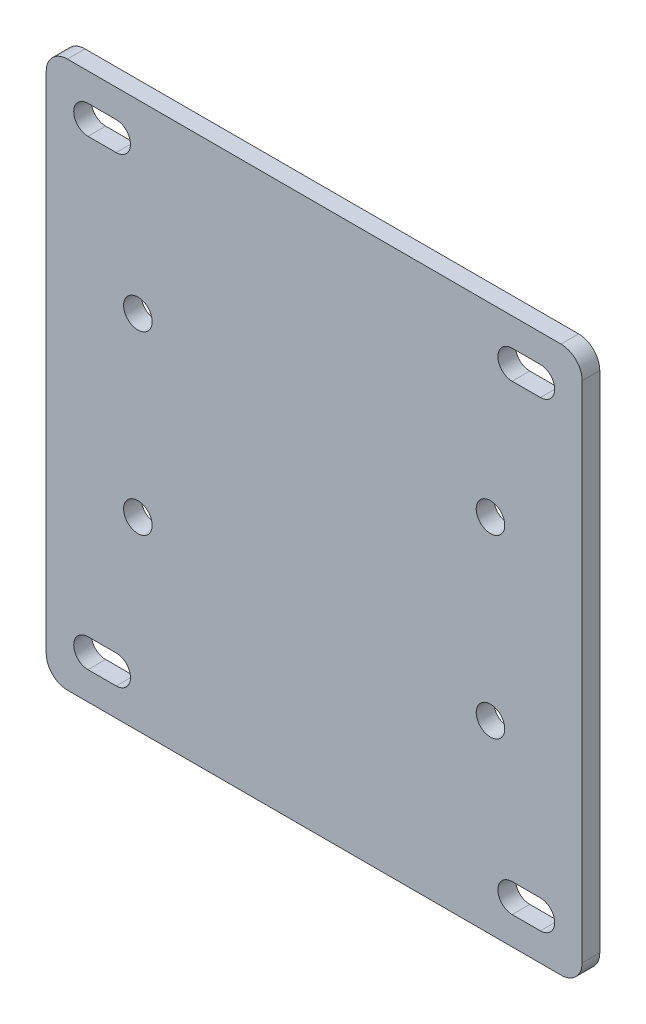
ISO-10303-21;
HEADER;
FILE_DESCRIPTION(('STEP AP214'),'2;1');
FILE_NAME('part.step','',(''),(''),'','','');
FILE_SCHEMA(('AUTOMOTIVE_DESIGN { 1 0 10303 214 1 1 1 1 }'));
ENDSEC;
DATA;
#1=APPLICATION_CONTEXT('core data for automotive mechanical design processes');
#2=APPLICATION_PROTOCOL_DEFINITION('international standard','automotive_design',2000,#1);
#3=PRODUCT_CONTEXT('',#1,'mechanical');
#4=PRODUCT('Part','Part','',(#3));
#5=PRODUCT_RELATED_PRODUCT_CATEGORY('part','',(#4));
#6=PRODUCT_DEFINITION_FORMATION('','',#4);
#7=PRODUCT_DEFINITION_CONTEXT('part definition',#1,'design');
#8=PRODUCT_DEFINITION('design','',#6,#7);
#9=PRODUCT_DEFINITION_SHAPE('','',#8);
#10=(LENGTH_UNIT() NAMED_UNIT(*) SI_UNIT(.MILLI.,.METRE.));
#11=(NAMED_UNIT(*) PLANE_ANGLE_UNIT() SI_UNIT($,.RADIAN.));
#12=(NAMED_UNIT(*) SI_UNIT($,.STERADIAN.) SOLID_ANGLE_UNIT());
#13=UNCERTAINTY_MEASURE_WITH_UNIT(LENGTH_MEASURE(1.E-05),#10,'distance_accuracy_value','');
#14=(GEOMETRIC_REPRESENTATION_CONTEXT(3) GLOBAL_UNCERTAINTY_ASSIGNED_CONTEXT((#13)) GLOBAL_UNIT_ASSIGNED_CONTEXT((#10,
#11,#12)) REPRESENTATION_CONTEXT('',''));
#15=CARTESIAN_POINT('',(0.,0.,0.));
#16=DIRECTION('',(0.,0.,1.));
#17=DIRECTION('',(1.,0.,0.));
#18=AXIS2_PLACEMENT_3D('',#15,#16,#17);
#19=CARTESIAN_POINT('',(0.,0.,5.));
#20=DIRECTION('',(0.,0.,1.));
#21=DIRECTION('',(1.,0.,0.));
#22=AXIS2_PLACEMENT_3D('',#19,#20,#21);
#23=PLANE('',#22);
#24=CARTESIAN_POINT('',(50.,-25.,5.));
#25=DIRECTION('',(0.,0.,-1.));
#26=DIRECTION('',(1.,0.,0.));
#27=AXIS2_PLACEMENT_3D('',#24,#25,#26);
#28=CIRCLE('',#27,4.05);
#29=CARTESIAN_POINT('',(45.95,-25.,5.));
#30=VERTEX_POINT('',#29);
#31=EDGE_CURVE('E417',#30,#30,#28,.T.);
#32=ORIENTED_EDGE('',*,*,#31,.T.);
#33=EDGE_LOOP('',(#32));
#34=FACE_BOUND('',#33,.T.);
#35=CARTESIAN_POINT('',(-50.,25.,5.));
#36=DIRECTION('',(0.,0.,-1.));
#37=DIRECTION('',(1.,0.,0.));
#38=AXIS2_PLACEMENT_3D('',#35,#36,#37);
#39=CIRCLE('',#38,4.05);
#40=CARTESIAN_POINT('',(-54.05,25.,5.));
#41=VERTEX_POINT('',#40);
#42=EDGE_CURVE('E295',#41,#41,#39,.T.);
#43=ORIENTED_EDGE('',*,*,#42,.T.);
#44=EDGE_LOOP('',(#43));
#45=FACE_BOUND('',#44,.T.);
#46=CARTESIAN_POINT('',(-50.,-25.,5.));
#47=DIRECTION('',(0.,0.,-1.));
#48=DIRECTION('',(1.,0.,0.));
#49=AXIS2_PLACEMENT_3D('',#46,#47,#48);
#50=CIRCLE('',#49,4.05);
#51=CARTESIAN_POINT('',(-54.05,-25.,5.));
#52=VERTEX_POINT('',#51);
#53=EDGE_CURVE('E346',#52,#52,#50,.T.);
#54=ORIENTED_EDGE('',*,*,#53,.T.);
#55=EDGE_LOOP('',(#54));
#56=FACE_BOUND('',#55,.T.);
#57=CARTESIAN_POINT('',(50.,25.,5.));
#58=DIRECTION('',(0.,0.,-1.));
#59=DIRECTION('',(1.,0.,0.));
#60=AXIS2_PLACEMENT_3D('',#57,#58,#59);
#61=CIRCLE('',#60,4.05);
#62=CARTESIAN_POINT('',(45.95,25.,5.));
#63=VERTEX_POINT('',#62);
#64=EDGE_CURVE('E344',#63,#63,#61,.T.);
#65=ORIENTED_EDGE('',*,*,#64,.T.);
#66=EDGE_LOOP('',(#65));
#67=FACE_BOUND('',#66,.T.);
#68=DIRECTION('',(1.,0.,0.));
#69=VECTOR('',#68,1.);
#70=CARTESIAN_POINT('',(-32.075,69.55,5.));
#71=LINE('',#70,#69);
#72=CARTESIAN_POINT('',(-64.15,69.55,5.));
#73=VERTEX_POINT('',#72);
#74=CARTESIAN_POINT('',(-56.15,69.55,5.));
#75=VERTEX_POINT('',#74);
#76=EDGE_CURVE('E290',#73,#75,#71,.T.);
#77=ORIENTED_EDGE('',*,*,#76,.T.);
#78=CARTESIAN_POINT('',(-56.15,65.5,5.));
#79=DIRECTION('',(0.,0.,-1.));
#80=DIRECTION('',(0.,1.,0.));
#81=AXIS2_PLACEMENT_3D('',#78,#79,#80);
#82=CIRCLE('',#81,4.05);
#83=CARTESIAN_POINT('',(-56.15,61.45,5.));
#84=VERTEX_POINT('',#83);
#85=EDGE_CURVE('E340',#75,#84,#82,.T.);
#86=ORIENTED_EDGE('',*,*,#85,.T.);
#87=DIRECTION('',(-1.,0.,0.));
#88=VECTOR('',#87,1.);
#89=CARTESIAN_POINT('',(-28.075,61.45,5.));
#90=LINE('',#89,#88);
#91=CARTESIAN_POINT('',(-64.15,61.45,5.));
#92=VERTEX_POINT('',#91);
#93=EDGE_CURVE('E422',#84,#92,#90,.T.);
#94=ORIENTED_EDGE('',*,*,#93,.T.);
#95=CARTESIAN_POINT('',(-64.15,65.5,5.));
#96=DIRECTION('',(0.,0.,-1.));
#97=DIRECTION('',(0.,-1.,0.));
#98=AXIS2_PLACEMENT_3D('',#95,#96,#97);
#99=CIRCLE('',#98,4.05);
#100=EDGE_CURVE('E391',#92,#73,#99,.T.);
#101=ORIENTED_EDGE('',*,*,#100,.T.);
#102=EDGE_LOOP('',(#77,#86,#94,#101));
#103=FACE_BOUND('',#102,.T.);
#104=DIRECTION('',(1.,0.,0.));
#105=VECTOR('',#104,1.);
#106=CARTESIAN_POINT('',(28.075,69.55,5.));
#107=LINE('',#106,#105);
#108=CARTESIAN_POINT('',(56.15,69.55,5.));
#109=VERTEX_POINT('',#108);
#110=CARTESIAN_POINT('',(64.15,69.55,5.));
#111=VERTEX_POINT('',#110);
#112=EDGE_CURVE('E339',#109,#111,#107,.T.);
#113=ORIENTED_EDGE('',*,*,#112,.T.);
#114=CARTESIAN_POINT('',(64.15,65.5,5.));
#115=DIRECTION('',(0.,0.,-1.));
#116=DIRECTION('',(0.,1.,0.));
#117=AXIS2_PLACEMENT_3D('',#114,#115,#116);
#118=CIRCLE('',#117,4.05);
#119=CARTESIAN_POINT('',(64.15,61.45,5.));
#120=VERTEX_POINT('',#119);
#121=EDGE_CURVE('E323',#111,#120,#118,.T.);
#122=ORIENTED_EDGE('',*,*,#121,.T.);
#123=DIRECTION('',(-1.,0.,0.));
#124=VECTOR('',#123,1.);
#125=CARTESIAN_POINT('',(32.075,61.45,5.));
#126=LINE('',#125,#124);
#127=CARTESIAN_POINT('',(56.15,61.45,5.));
#128=VERTEX_POINT('',#127);
#129=EDGE_CURVE('E470',#120,#128,#126,.T.);
#130=ORIENTED_EDGE('',*,*,#129,.T.);
#131=CARTESIAN_POINT('',(56.15,65.5,5.));
#132=DIRECTION('',(0.,0.,-1.));
#133=DIRECTION('',(0.,-1.,0.));
#134=AXIS2_PLACEMENT_3D('',#131,#132,#133);
#135=CIRCLE('',#134,4.05);
#136=EDGE_CURVE('E407',#128,#109,#135,.T.);
#137=ORIENTED_EDGE('',*,*,#136,.T.);
#138=EDGE_LOOP('',(#113,#122,#130,#137));
#139=FACE_BOUND('',#138,.T.);
#140=DIRECTION('',(1.,0.,0.));
#141=VECTOR('',#140,1.);
#142=CARTESIAN_POINT('',(-32.075,-61.45,5.));
#143=LINE('',#142,#141);
#144=CARTESIAN_POINT('',(-64.15,-61.45,5.));
#145=VERTEX_POINT('',#144);
#146=CARTESIAN_POINT('',(-56.15,-61.45,5.));
#147=VERTEX_POINT('',#146);
#148=EDGE_CURVE('E299',#145,#147,#143,.T.);
#149=ORIENTED_EDGE('',*,*,#148,.T.);
#150=CARTESIAN_POINT('',(-56.15,-65.5,5.));
#151=DIRECTION('',(0.,0.,-1.));
#152=DIRECTION('',(0.,1.,0.));
#153=AXIS2_PLACEMENT_3D('',#150,#151,#152);
#154=CIRCLE('',#153,4.05);
#155=CARTESIAN_POINT('',(-56.15,-69.55,5.));
#156=VERTEX_POINT('',#155);
#157=EDGE_CURVE('E500',#147,#156,#154,.T.);
#158=ORIENTED_EDGE('',*,*,#157,.T.);
#159=DIRECTION('',(-1.,0.,0.));
#160=VECTOR('',#159,1.);
#161=CARTESIAN_POINT('',(-28.075,-69.55,5.));
#162=LINE('',#161,#160);
#163=CARTESIAN_POINT('',(-64.15,-69.55,5.));
#164=VERTEX_POINT('',#163);
#165=EDGE_CURVE('E437',#156,#164,#162,.T.);
#166=ORIENTED_EDGE('',*,*,#165,.T.);
#167=CARTESIAN_POINT('',(-64.15,-65.5,5.));
#168=DIRECTION('',(0.,0.,-1.));
#169=DIRECTION('',(0.,-1.,0.));
#170=AXIS2_PLACEMENT_3D('',#167,#168,#169);
#171=CIRCLE('',#170,4.05);
#172=EDGE_CURVE('E465',#164,#145,#171,.T.);
#173=ORIENTED_EDGE('',*,*,#172,.T.);
#174=EDGE_LOOP('',(#149,#158,#166,#173));
#175=FACE_BOUND('',#174,.T.);
#176=DIRECTION('',(1.,0.,0.));
#177=VECTOR('',#176,1.);
#178=CARTESIAN_POINT('',(28.075,-61.45,5.));
#179=LINE('',#178,#177);
#180=CARTESIAN_POINT('',(56.15,-61.45,5.));
#181=VERTEX_POINT('',#180);
#182=CARTESIAN_POINT('',(64.15,-61.45,5.));
#183=VERTEX_POINT('',#182);
#184=EDGE_CURVE('E328',#181,#183,#179,.T.);
#185=ORIENTED_EDGE('',*,*,#184,.T.);
#186=CARTESIAN_POINT('',(64.15,-65.5,5.));
#187=DIRECTION('',(0.,0.,-1.));
#188=DIRECTION('',(0.,1.,0.));
#189=AXIS2_PLACEMENT_3D('',#186,#187,#188);
#190=CIRCLE('',#189,4.05);
#191=CARTESIAN_POINT('',(64.15,-69.55,5.));
#192=VERTEX_POINT('',#191);
#193=EDGE_CURVE('E312',#183,#192,#190,.T.);
#194=ORIENTED_EDGE('',*,*,#193,.T.);
#195=DIRECTION('',(-1.,0.,0.));
#196=VECTOR('',#195,1.);
#197=CARTESIAN_POINT('',(32.075,-69.55,5.));
#198=LINE('',#197,#196);
#199=CARTESIAN_POINT('',(56.15,-69.55,5.));
#200=VERTEX_POINT('',#199);
#201=EDGE_CURVE('E376',#192,#200,#198,.T.);
#202=ORIENTED_EDGE('',*,*,#201,.T.);
#203=CARTESIAN_POINT('',(56.15,-65.5,5.));
#204=DIRECTION('',(0.,0.,-1.));
#205=DIRECTION('',(0.,-1.,0.));
#206=AXIS2_PLACEMENT_3D('',#203,#204,#205);
#207=CIRCLE('',#206,4.05);
#208=EDGE_CURVE('E371',#200,#181,#207,.T.);
#209=ORIENTED_EDGE('',*,*,#208,.T.);
#210=EDGE_LOOP('',(#185,#194,#202,#209));
#211=FACE_BOUND('',#210,.T.);
#212=DIRECTION('',(-1.,0.,0.));
#213=VECTOR('',#212,1.);
#214=CARTESIAN_POINT('',(-70.,77.5,5.));
#215=LINE('',#214,#213);
#216=CARTESIAN_POINT('',(70.,77.5,5.));
#217=VERTEX_POINT('',#216);
#218=CARTESIAN_POINT('',(-70.,77.5,5.));
#219=VERTEX_POINT('',#218);
#220=EDGE_CURVE('E11',#217,#219,#215,.T.);
#221=ORIENTED_EDGE('',*,*,#220,.T.);
#222=CARTESIAN_POINT('',(-70.,71.5,5.));
#223=DIRECTION('',(0.,0.,1.));
#224=DIRECTION('',(0.,-1.,0.));
#225=AXIS2_PLACEMENT_3D('',#222,#223,#224);
#226=CIRCLE('',#225,6.);
#227=CARTESIAN_POINT('',(-76.,71.5,5.));
#228=VERTEX_POINT('',#227);
#229=EDGE_CURVE('E366',#219,#228,#226,.T.);
#230=ORIENTED_EDGE('',*,*,#229,.T.);
#231=DIRECTION('',(0.,-1.,0.));
#232=VECTOR('',#231,1.);
#233=CARTESIAN_POINT('',(-76.,-71.5,5.));
#234=LINE('',#233,#232);
#235=CARTESIAN_POINT('',(-76.,-71.5,5.));
#236=VERTEX_POINT('',#235);
#237=EDGE_CURVE('E255',#228,#236,#234,.T.);
#238=ORIENTED_EDGE('',*,*,#237,.T.);
#239=CARTESIAN_POINT('',(-70.,-71.5,5.));
#240=DIRECTION('',(0.,0.,1.));
#241=DIRECTION('',(1.,0.,0.));
#242=AXIS2_PLACEMENT_3D('',#239,#240,#241);
#243=CIRCLE('',#242,6.);
#244=CARTESIAN_POINT('',(-70.,-77.5,5.));
#245=VERTEX_POINT('',#244);
#246=EDGE_CURVE('E262',#236,#245,#243,.T.);
#247=ORIENTED_EDGE('',*,*,#246,.T.);
#248=DIRECTION('',(1.,0.,0.));
#249=VECTOR('',#248,1.);
#250=CARTESIAN_POINT('',(70.,-77.5,5.));
#251=LINE('',#250,#249);
#252=CARTESIAN_POINT('',(70.,-77.5,5.));
#253=VERTEX_POINT('',#252);
#254=EDGE_CURVE('E279',#245,#253,#251,.T.);
#255=ORIENTED_EDGE('',*,*,#254,.T.);
#256=CARTESIAN_POINT('',(70.,-71.5,5.));
#257=DIRECTION('',(0.,0.,1.));
#258=DIRECTION('',(0.,1.,0.));
#259=AXIS2_PLACEMENT_3D('',#256,#257,#258);
#260=CIRCLE('',#259,6.);
#261=CARTESIAN_POINT('',(76.,-71.5,5.));
#262=VERTEX_POINT('',#261);
#263=EDGE_CURVE('E361',#253,#262,#260,.T.);
#264=ORIENTED_EDGE('',*,*,#263,.T.);
#265=DIRECTION('',(0.,1.,0.));
#266=VECTOR('',#265,1.);
#267=CARTESIAN_POINT('',(76.,71.5,5.));
#268=LINE('',#267,#266);
#269=CARTESIAN_POINT('',(76.,71.5,5.));
#270=VERTEX_POINT('',#269);
#271=EDGE_CURVE('E384',#262,#270,#268,.T.);
#272=ORIENTED_EDGE('',*,*,#271,.T.);
#273=CARTESIAN_POINT('',(70.,71.5,5.));
#274=DIRECTION('',(0.,0.,1.));
#275=DIRECTION('',(-1.,0.,0.));
#276=AXIS2_PLACEMENT_3D('',#273,#274,#275);
#277=CIRCLE('',#276,6.);
#278=EDGE_CURVE('E357',#270,#217,#277,.T.);
#279=ORIENTED_EDGE('',*,*,#278,.T.);
#280=EDGE_LOOP('',(#221,#230,#238,#247,#255,#264,#272,#279));
#281=FACE_BOUND('',#280,.T.);
#282=ADVANCED_FACE('F17',(#34,#45,#56,#67,#103,#139,#175,#211,#281),#23,.T.);
#283=CARTESIAN_POINT('',(0.,0.,0.));
#284=DIRECTION('',(0.,0.,1.));
#285=DIRECTION('',(1.,0.,0.));
#286=AXIS2_PLACEMENT_3D('',#283,#284,#285);
#287=PLANE('',#286);
#288=CARTESIAN_POINT('',(50.,-25.,0.));
#289=DIRECTION('',(0.,0.,1.));
#290=DIRECTION('',(1.,0.,0.));
#291=AXIS2_PLACEMENT_3D('',#288,#289,#290);
#292=CIRCLE('',#291,4.05);
#293=CARTESIAN_POINT('',(45.95,-25.,0.));
#294=VERTEX_POINT('',#293);
#295=EDGE_CURVE('E432',#294,#294,#292,.T.);
#296=ORIENTED_EDGE('',*,*,#295,.T.);
#297=EDGE_LOOP('',(#296));
#298=FACE_BOUND('',#297,.T.);
#299=CARTESIAN_POINT('',(-50.,25.,0.));
#300=DIRECTION('',(0.,0.,1.));
#301=DIRECTION('',(1.,0.,0.));
#302=AXIS2_PLACEMENT_3D('',#299,#300,#301);
#303=CIRCLE('',#302,4.05);
#304=CARTESIAN_POINT('',(-54.05,25.,0.));
#305=VERTEX_POINT('',#304);
#306=EDGE_CURVE('E294',#305,#305,#303,.T.);
#307=ORIENTED_EDGE('',*,*,#306,.T.);
#308=EDGE_LOOP('',(#307));
#309=FACE_BOUND('',#308,.T.);
#310=CARTESIAN_POINT('',(-50.,-25.,0.));
#311=DIRECTION('',(0.,0.,1.));
#312=DIRECTION('',(1.,0.,0.));
#313=AXIS2_PLACEMENT_3D('',#310,#311,#312);
#314=CIRCLE('',#313,4.05);
#315=CARTESIAN_POINT('',(-54.05,-25.,0.));
#316=VERTEX_POINT('',#315);
#317=EDGE_CURVE('E416',#316,#316,#314,.T.);
#318=ORIENTED_EDGE('',*,*,#317,.T.);
#319=EDGE_LOOP('',(#318));
#320=FACE_BOUND('',#319,.T.);
#321=CARTESIAN_POINT('',(50.,25.,0.));
#322=DIRECTION('',(0.,0.,1.));
#323=DIRECTION('',(1.,0.,0.));
#324=AXIS2_PLACEMENT_3D('',#321,#322,#323);
#325=CIRCLE('',#324,4.05);
#326=CARTESIAN_POINT('',(45.95,25.,0.));
#327=VERTEX_POINT('',#326);
#328=EDGE_CURVE('E351',#327,#327,#325,.T.);
#329=ORIENTED_EDGE('',*,*,#328,.T.);
#330=EDGE_LOOP('',(#329));
#331=FACE_BOUND('',#330,.T.);
#332=DIRECTION('',(-1.,0.,0.));
#333=VECTOR('',#332,1.);
#334=CARTESIAN_POINT('',(-32.075,69.55,0.));
#335=LINE('',#334,#333);
#336=CARTESIAN_POINT('',(-56.15,69.55,0.));
#337=VERTEX_POINT('',#336);
#338=CARTESIAN_POINT('',(-64.15,69.55,0.));
#339=VERTEX_POINT('',#338);
#340=EDGE_CURVE('E326',#337,#339,#335,.T.);
#341=ORIENTED_EDGE('',*,*,#340,.T.);
#342=CARTESIAN_POINT('',(-64.15,65.5,0.));
#343=DIRECTION('',(0.,0.,1.));
#344=DIRECTION('',(0.,-1.,0.));
#345=AXIS2_PLACEMENT_3D('',#342,#343,#344);
#346=CIRCLE('',#345,4.05);
#347=CARTESIAN_POINT('',(-64.15,61.45,0.));
#348=VERTEX_POINT('',#347);
#349=EDGE_CURVE('E289',#339,#348,#346,.T.);
#350=ORIENTED_EDGE('',*,*,#349,.T.);
#351=DIRECTION('',(1.,0.,0.));
#352=VECTOR('',#351,1.);
#353=CARTESIAN_POINT('',(-28.075,61.45,0.));
#354=LINE('',#353,#352);
#355=CARTESIAN_POINT('',(-56.15,61.45,0.));
#356=VERTEX_POINT('',#355);
#357=EDGE_CURVE('E426',#348,#356,#354,.T.);
#358=ORIENTED_EDGE('',*,*,#357,.T.);
#359=CARTESIAN_POINT('',(-56.15,65.5,0.));
#360=DIRECTION('',(0.,0.,1.));
#361=DIRECTION('',(0.,1.,0.));
#362=AXIS2_PLACEMENT_3D('',#359,#360,#361);
#363=CIRCLE('',#362,4.05);
#364=EDGE_CURVE('E345',#356,#337,#363,.T.);
#365=ORIENTED_EDGE('',*,*,#364,.T.);
#366=EDGE_LOOP('',(#341,#350,#358,#365));
#367=FACE_BOUND('',#366,.T.);
#368=DIRECTION('',(-1.,0.,0.));
#369=VECTOR('',#368,1.);
#370=CARTESIAN_POINT('',(28.075,69.55,0.));
#371=LINE('',#370,#369);
#372=CARTESIAN_POINT('',(64.15,69.55,0.));
#373=VERTEX_POINT('',#372);
#374=CARTESIAN_POINT('',(56.15,69.55,0.));
#375=VERTEX_POINT('',#374);
#376=EDGE_CURVE('E461',#373,#375,#371,.T.);
#377=ORIENTED_EDGE('',*,*,#376,.T.);
#378=CARTESIAN_POINT('',(56.15,65.5,0.));
#379=DIRECTION('',(0.,0.,1.));
#380=DIRECTION('',(0.,-1.,0.));
#381=AXIS2_PLACEMENT_3D('',#378,#379,#380);
#382=CIRCLE('',#381,4.05);
#383=CARTESIAN_POINT('',(56.15,61.45,0.));
#384=VERTEX_POINT('',#383);
#385=EDGE_CURVE('E338',#375,#384,#382,.T.);
#386=ORIENTED_EDGE('',*,*,#385,.T.);
#387=DIRECTION('',(1.,0.,0.));
#388=VECTOR('',#387,1.);
#389=CARTESIAN_POINT('',(32.075,61.45,0.));
#390=LINE('',#389,#388);
#391=CARTESIAN_POINT('',(64.15,61.45,0.));
#392=VERTEX_POINT('',#391);
#393=EDGE_CURVE('E555',#384,#392,#390,.T.);
#394=ORIENTED_EDGE('',*,*,#393,.T.);
#395=CARTESIAN_POINT('',(64.15,65.5,0.));
#396=DIRECTION('',(0.,0.,1.));
#397=DIRECTION('',(0.,1.,0.));
#398=AXIS2_PLACEMENT_3D('',#395,#396,#397);
#399=CIRCLE('',#398,4.05);
#400=EDGE_CURVE('E327',#392,#373,#399,.T.);
#401=ORIENTED_EDGE('',*,*,#400,.T.);
#402=EDGE_LOOP('',(#377,#386,#394,#401));
#403=FACE_BOUND('',#402,.T.);
#404=DIRECTION('',(-1.,0.,0.));
#405=VECTOR('',#404,1.);
#406=CARTESIAN_POINT('',(-32.075,-61.45,0.));
#407=LINE('',#406,#405);
#408=CARTESIAN_POINT('',(-56.15,-61.45,0.));
#409=VERTEX_POINT('',#408);
#410=CARTESIAN_POINT('',(-64.15,-61.45,0.));
#411=VERTEX_POINT('',#410);
#412=EDGE_CURVE('E300',#409,#411,#407,.T.);
#413=ORIENTED_EDGE('',*,*,#412,.T.);
#414=CARTESIAN_POINT('',(-64.15,-65.5,0.));
#415=DIRECTION('',(0.,0.,1.));
#416=DIRECTION('',(0.,-1.,0.));
#417=AXIS2_PLACEMENT_3D('',#414,#415,#416);
#418=CIRCLE('',#417,4.05);
#419=CARTESIAN_POINT('',(-64.15,-69.55,0.));
#420=VERTEX_POINT('',#419);
#421=EDGE_CURVE('E520',#411,#420,#418,.T.);
#422=ORIENTED_EDGE('',*,*,#421,.T.);
#423=DIRECTION('',(1.,0.,0.));
#424=VECTOR('',#423,1.);
#425=CARTESIAN_POINT('',(-28.075,-69.55,0.));
#426=LINE('',#425,#424);
#427=CARTESIAN_POINT('',(-56.15,-69.55,0.));
#428=VERTEX_POINT('',#427);
#429=EDGE_CURVE('E433',#420,#428,#426,.T.);
#430=ORIENTED_EDGE('',*,*,#429,.T.);
#431=CARTESIAN_POINT('',(-56.15,-65.5,0.));
#432=DIRECTION('',(0.,0.,1.));
#433=DIRECTION('',(0.,1.,0.));
#434=AXIS2_PLACEMENT_3D('',#431,#432,#433);
#435=CIRCLE('',#434,4.05);
#436=EDGE_CURVE('E492',#428,#409,#435,.T.);
#437=ORIENTED_EDGE('',*,*,#436,.T.);
#438=EDGE_LOOP('',(#413,#422,#430,#437));
#439=FACE_BOUND('',#438,.T.);
#440=DIRECTION('',(-1.,0.,0.));
#441=VECTOR('',#440,1.);
#442=CARTESIAN_POINT('',(28.075,-61.45,0.));
#443=LINE('',#442,#441);
#444=CARTESIAN_POINT('',(64.15,-61.45,0.));
#445=VERTEX_POINT('',#444);
#446=CARTESIAN_POINT('',(56.15,-61.45,0.));
#447=VERTEX_POINT('',#446);
#448=EDGE_CURVE('E477',#445,#447,#443,.T.);
#449=ORIENTED_EDGE('',*,*,#448,.T.);
#450=CARTESIAN_POINT('',(56.15,-65.5,0.));
#451=DIRECTION('',(0.,0.,1.));
#452=DIRECTION('',(0.,-1.,0.));
#453=AXIS2_PLACEMENT_3D('',#450,#451,#452);
#454=CIRCLE('',#453,4.05);
#455=CARTESIAN_POINT('',(56.15,-69.55,0.));
#456=VERTEX_POINT('',#455);
#457=EDGE_CURVE('E367',#447,#456,#454,.T.);
#458=ORIENTED_EDGE('',*,*,#457,.T.);
#459=DIRECTION('',(1.,0.,0.));
#460=VECTOR('',#459,1.);
#461=CARTESIAN_POINT('',(32.075,-69.55,0.));
#462=LINE('',#461,#460);
#463=CARTESIAN_POINT('',(64.15,-69.55,0.));
#464=VERTEX_POINT('',#463);
#465=EDGE_CURVE('E398',#456,#464,#462,.T.);
#466=ORIENTED_EDGE('',*,*,#465,.T.);
#467=CARTESIAN_POINT('',(64.15,-65.5,0.));
#468=DIRECTION('',(0.,0.,1.));
#469=DIRECTION('',(0.,1.,0.));
#470=AXIS2_PLACEMENT_3D('',#467,#468,#469);
#471=CIRCLE('',#470,4.05);
#472=EDGE_CURVE('E319',#464,#445,#471,.T.);
#473=ORIENTED_EDGE('',*,*,#472,.T.);
#474=EDGE_LOOP('',(#449,#458,#466,#473));
#475=FACE_BOUND('',#474,.T.);
#476=DIRECTION('',(1.,0.,0.));
#477=VECTOR('',#476,1.);
#478=CARTESIAN_POINT('',(-70.,77.5,0.));
#479=LINE('',#478,#477);
#480=CARTESIAN_POINT('',(-70.,77.5,0.));
#481=VERTEX_POINT('',#480);
#482=CARTESIAN_POINT('',(70.,77.5,0.));
#483=VERTEX_POINT('',#482);
#484=EDGE_CURVE('E28',#481,#483,#479,.T.);
#485=ORIENTED_EDGE('',*,*,#484,.T.);
#486=CARTESIAN_POINT('',(70.,71.5,0.));
#487=DIRECTION('',(0.,0.,-1.));
#488=DIRECTION('',(-1.,0.,0.));
#489=AXIS2_PLACEMENT_3D('',#486,#487,#488);
#490=CIRCLE('',#489,6.);
#491=CARTESIAN_POINT('',(76.,71.5,0.));
#492=VERTEX_POINT('',#491);
#493=EDGE_CURVE('E427',#483,#492,#490,.T.);
#494=ORIENTED_EDGE('',*,*,#493,.T.);
#495=DIRECTION('',(0.,-1.,0.));
#496=VECTOR('',#495,1.);
#497=CARTESIAN_POINT('',(76.,71.5,0.));
#498=LINE('',#497,#496);
#499=CARTESIAN_POINT('',(76.,-71.5,0.));
#500=VERTEX_POINT('',#499);
#501=EDGE_CURVE('E356',#492,#500,#498,.T.);
#502=ORIENTED_EDGE('',*,*,#501,.T.);
#503=CARTESIAN_POINT('',(70.,-71.5,0.));
#504=DIRECTION('',(0.,0.,-1.));
#505=DIRECTION('',(0.,1.,0.));
#506=AXIS2_PLACEMENT_3D('',#503,#504,#505);
#507=CIRCLE('',#506,6.);
#508=CARTESIAN_POINT('',(70.,-77.5,0.));
#509=VERTEX_POINT('',#508);
#510=EDGE_CURVE('E358',#500,#509,#507,.T.);
#511=ORIENTED_EDGE('',*,*,#510,.T.);
#512=DIRECTION('',(-1.,0.,0.));
#513=VECTOR('',#512,1.);
#514=CARTESIAN_POINT('',(70.,-77.5,0.));
#515=LINE('',#514,#513);
#516=CARTESIAN_POINT('',(-70.,-77.5,0.));
#517=VERTEX_POINT('',#516);
#518=EDGE_CURVE('E269',#509,#517,#515,.T.);
#519=ORIENTED_EDGE('',*,*,#518,.T.);
#520=CARTESIAN_POINT('',(-70.,-71.5,0.));
#521=DIRECTION('',(0.,0.,-1.));
#522=DIRECTION('',(1.,0.,0.));
#523=AXIS2_PLACEMENT_3D('',#520,#521,#522);
#524=CIRCLE('',#523,6.);
#525=CARTESIAN_POINT('',(-76.,-71.5,0.));
#526=VERTEX_POINT('',#525);
#527=EDGE_CURVE('E260',#517,#526,#524,.T.);
#528=ORIENTED_EDGE('',*,*,#527,.T.);
#529=DIRECTION('',(0.,1.,0.));
#530=VECTOR('',#529,1.);
#531=CARTESIAN_POINT('',(-76.,-71.5,0.));
#532=LINE('',#531,#530);
#533=CARTESIAN_POINT('',(-76.,71.5,0.));
#534=VERTEX_POINT('',#533);
#535=EDGE_CURVE('E243',#526,#534,#532,.T.);
#536=ORIENTED_EDGE('',*,*,#535,.T.);
#537=CARTESIAN_POINT('',(-70.,71.5,0.));
#538=DIRECTION('',(0.,0.,-1.));
#539=DIRECTION('',(0.,-1.,0.));
#540=AXIS2_PLACEMENT_3D('',#537,#538,#539);
#541=CIRCLE('',#540,6.);
#542=EDGE_CURVE('E363',#534,#481,#541,.T.);
#543=ORIENTED_EDGE('',*,*,#542,.T.);
#544=EDGE_LOOP('',(#485,#494,#502,#511,#519,#528,#536,#543));
#545=FACE_BOUND('',#544,.T.);
#546=ADVANCED_FACE('F267',(#298,#309,#320,#331,#367,#403,#439,#475,#545),#287,.F.);
#547=CARTESIAN_POINT('',(70.,77.5,0.));
#548=DIRECTION('',(0.,1.,0.));
#549=DIRECTION('',(1.,0.,0.));
#550=AXIS2_PLACEMENT_3D('',#547,#548,#549);
#551=PLANE('',#550);
#552=ORIENTED_EDGE('',*,*,#484,.F.);
#553=DIRECTION('',(0.,0.,1.));
#554=VECTOR('',#553,1.);
#555=CARTESIAN_POINT('',(-70.,77.5,0.));
#556=LINE('',#555,#554);
#557=EDGE_CURVE('E386',#481,#219,#556,.T.);
#558=ORIENTED_EDGE('',*,*,#557,.T.);
#559=ORIENTED_EDGE('',*,*,#220,.F.);
#560=DIRECTION('',(0.,0.,1.));
#561=VECTOR('',#560,1.);
#562=CARTESIAN_POINT('',(70.,77.5,0.));
#563=LINE('',#562,#561);
#564=EDGE_CURVE('E431',#483,#217,#563,.T.);
#565=ORIENTED_EDGE('',*,*,#564,.F.);
#566=EDGE_LOOP('',(#552,#558,#559,#565));
#567=FACE_BOUND('',#566,.T.);
#568=ADVANCED_FACE('F603',(#567),#551,.T.);
#569=CARTESIAN_POINT('',(-70.,71.5,0.));
#570=DIRECTION('',(0.,0.,1.));
#571=DIRECTION('',(0.,-1.,0.));
#572=AXIS2_PLACEMENT_3D('',#569,#570,#571);
#573=CYLINDRICAL_SURFACE('',#572,6.);
#574=ORIENTED_EDGE('',*,*,#542,.F.);
#575=DIRECTION('',(0.,0.,1.));
#576=VECTOR('',#575,1.);
#577=CARTESIAN_POINT('',(-76.,71.5,0.));
#578=LINE('',#577,#576);
#579=EDGE_CURVE('E250',#534,#228,#578,.T.);
#580=ORIENTED_EDGE('',*,*,#579,.T.);
#581=ORIENTED_EDGE('',*,*,#229,.F.);
#582=ORIENTED_EDGE('',*,*,#557,.F.);
#583=EDGE_LOOP('',(#574,#580,#581,#582));
#584=FACE_BOUND('',#583,.T.);
#585=ADVANCED_FACE('F668',(#584),#573,.T.);
#586=CARTESIAN_POINT('',(-76.,71.5,0.));
#587=DIRECTION('',(-1.,0.,0.));
#588=DIRECTION('',(0.,0.,1.));
#589=AXIS2_PLACEMENT_3D('',#586,#587,#588);
#590=PLANE('',#589);
#591=ORIENTED_EDGE('',*,*,#535,.F.);
#592=DIRECTION('',(0.,0.,1.));
#593=VECTOR('',#592,1.);
#594=CARTESIAN_POINT('',(-76.,-71.5,0.));
#595=LINE('',#594,#593);
#596=EDGE_CURVE('E247',#526,#236,#595,.T.);
#597=ORIENTED_EDGE('',*,*,#596,.T.);
#598=ORIENTED_EDGE('',*,*,#237,.F.);
#599=ORIENTED_EDGE('',*,*,#579,.F.);
#600=EDGE_LOOP('',(#591,#597,#598,#599));
#601=FACE_BOUND('',#600,.T.);
#602=ADVANCED_FACE('F245',(#601),#590,.T.);
#603=CARTESIAN_POINT('',(-70.,-71.5,0.));
#604=DIRECTION('',(0.,0.,1.));
#605=DIRECTION('',(1.,0.,0.));
#606=AXIS2_PLACEMENT_3D('',#603,#604,#605);
#607=CYLINDRICAL_SURFACE('',#606,6.);
#608=ORIENTED_EDGE('',*,*,#527,.F.);
#609=DIRECTION('',(0.,0.,1.));
#610=VECTOR('',#609,1.);
#611=CARTESIAN_POINT('',(-70.,-77.5,0.));
#612=LINE('',#611,#610);
#613=EDGE_CURVE('E271',#517,#245,#612,.T.);
#614=ORIENTED_EDGE('',*,*,#613,.T.);
#615=ORIENTED_EDGE('',*,*,#246,.F.);
#616=ORIENTED_EDGE('',*,*,#596,.F.);
#617=EDGE_LOOP('',(#608,#614,#615,#616));
#618=FACE_BOUND('',#617,.T.);
#619=ADVANCED_FACE('F258',(#618),#607,.T.);
#620=CARTESIAN_POINT('',(-70.,-77.5,0.));
#621=DIRECTION('',(0.,-1.,0.));
#622=DIRECTION('',(0.,0.,-1.));
#623=AXIS2_PLACEMENT_3D('',#620,#621,#622);
#624=PLANE('',#623);
#625=ORIENTED_EDGE('',*,*,#518,.F.);
#626=DIRECTION('',(0.,0.,1.));
#627=VECTOR('',#626,1.);
#628=CARTESIAN_POINT('',(70.,-77.5,0.));
#629=LINE('',#628,#627);
#630=EDGE_CURVE('E443',#509,#253,#629,.T.);
#631=ORIENTED_EDGE('',*,*,#630,.T.);
#632=ORIENTED_EDGE('',*,*,#254,.F.);
#633=ORIENTED_EDGE('',*,*,#613,.F.);
#634=EDGE_LOOP('',(#625,#631,#632,#633));
#635=FACE_BOUND('',#634,.T.);
#636=ADVANCED_FACE('F649',(#635),#624,.T.);
#637=CARTESIAN_POINT('',(70.,-71.5,0.));
#638=DIRECTION('',(0.,0.,1.));
#639=DIRECTION('',(0.,1.,0.));
#640=AXIS2_PLACEMENT_3D('',#637,#638,#639);
#641=CYLINDRICAL_SURFACE('',#640,6.);
#642=ORIENTED_EDGE('',*,*,#510,.F.);
#643=DIRECTION('',(0.,0.,1.));
#644=VECTOR('',#643,1.);
#645=CARTESIAN_POINT('',(76.,-71.5,0.));
#646=LINE('',#645,#644);
#647=EDGE_CURVE('E362',#500,#262,#646,.T.);
#648=ORIENTED_EDGE('',*,*,#647,.T.);
#649=ORIENTED_EDGE('',*,*,#263,.F.);
#650=ORIENTED_EDGE('',*,*,#630,.F.);
#651=EDGE_LOOP('',(#642,#648,#649,#650));
#652=FACE_BOUND('',#651,.T.);
#653=ADVANCED_FACE('F664',(#652),#641,.T.);
#654=CARTESIAN_POINT('',(76.,-71.5,0.));
#655=DIRECTION('',(1.,0.,0.));
#656=DIRECTION('',(0.,1.,0.));
#657=AXIS2_PLACEMENT_3D('',#654,#655,#656);
#658=PLANE('',#657);
#659=ORIENTED_EDGE('',*,*,#501,.F.);
#660=DIRECTION('',(0.,0.,1.));
#661=VECTOR('',#660,1.);
#662=CARTESIAN_POINT('',(76.,71.5,0.));
#663=LINE('',#662,#661);
#664=EDGE_CURVE('E352',#492,#270,#663,.T.);
#665=ORIENTED_EDGE('',*,*,#664,.T.);
#666=ORIENTED_EDGE('',*,*,#271,.F.);
#667=ORIENTED_EDGE('',*,*,#647,.F.);
#668=EDGE_LOOP('',(#659,#665,#666,#667));
#669=FACE_BOUND('',#668,.T.);
#670=ADVANCED_FACE('F661',(#669),#658,.T.);
#671=CARTESIAN_POINT('',(70.,71.5,0.));
#672=DIRECTION('',(0.,0.,1.));
#673=DIRECTION('',(-1.,0.,0.));
#674=AXIS2_PLACEMENT_3D('',#671,#672,#673);
#675=CYLINDRICAL_SURFACE('',#674,6.);
#676=ORIENTED_EDGE('',*,*,#493,.F.);
#677=ORIENTED_EDGE('',*,*,#564,.T.);
#678=ORIENTED_EDGE('',*,*,#278,.F.);
#679=ORIENTED_EDGE('',*,*,#664,.F.);
#680=EDGE_LOOP('',(#676,#677,#678,#679));
#681=FACE_BOUND('',#680,.T.);
#682=ADVANCED_FACE('F654',(#681),#675,.T.);
#683=CARTESIAN_POINT('',(50.,-25.,-212.149717936727));
#684=DIRECTION('',(0.,0.,1.));
#685=DIRECTION('',(1.,0.,0.));
#686=AXIS2_PLACEMENT_3D('',#683,#684,#685);
#687=CYLINDRICAL_SURFACE('',#686,4.05);
#688=ORIENTED_EDGE('',*,*,#31,.F.);
#689=DIRECTION('',(0.,0.,-1.));
#690=VECTOR('',#689,1.);
#691=CARTESIAN_POINT('',(45.95,-25.,-212.149717936727));
#692=LINE('',#691,#690);
#693=EDGE_CURVE('E421',#30,#294,#692,.T.);
#694=ORIENTED_EDGE('',*,*,#693,.T.);
#695=ORIENTED_EDGE('',*,*,#295,.F.);
#696=ORIENTED_EDGE('',*,*,#693,.F.);
#697=EDGE_LOOP('',(#688,#694,#695,#696));
#698=FACE_BOUND('',#697,.T.);
#699=ADVANCED_FACE('F650',(#698),#687,.F.);
#700=CARTESIAN_POINT('',(-50.,25.,-212.149717936727));
#701=DIRECTION('',(0.,0.,1.));
#702=DIRECTION('',(1.,0.,0.));
#703=AXIS2_PLACEMENT_3D('',#700,#701,#702);
#704=CYLINDRICAL_SURFACE('',#703,4.05);
#705=ORIENTED_EDGE('',*,*,#42,.F.);
#706=DIRECTION('',(0.,0.,-1.));
#707=VECTOR('',#706,1.);
#708=CARTESIAN_POINT('',(-54.05,25.,-212.149717936727));
#709=LINE('',#708,#707);
#710=EDGE_CURVE('E291',#41,#305,#709,.T.);
#711=ORIENTED_EDGE('',*,*,#710,.T.);
#712=ORIENTED_EDGE('',*,*,#306,.F.);
#713=ORIENTED_EDGE('',*,*,#710,.F.);
#714=EDGE_LOOP('',(#705,#711,#712,#713));
#715=FACE_BOUND('',#714,.T.);
#716=ADVANCED_FACE('F653',(#715),#704,.F.);
#717=CARTESIAN_POINT('',(-50.,-25.,-212.149717936727));
#718=DIRECTION('',(0.,0.,1.));
#719=DIRECTION('',(1.,0.,0.));
#720=AXIS2_PLACEMENT_3D('',#717,#718,#719);
#721=CYLINDRICAL_SURFACE('',#720,4.05);
#722=ORIENTED_EDGE('',*,*,#53,.F.);
#723=DIRECTION('',(0.,0.,-1.));
#724=VECTOR('',#723,1.);
#725=CARTESIAN_POINT('',(-54.05,-25.,-212.149717936727));
#726=LINE('',#725,#724);
#727=EDGE_CURVE('E350',#52,#316,#726,.T.);
#728=ORIENTED_EDGE('',*,*,#727,.T.);
#729=ORIENTED_EDGE('',*,*,#317,.F.);
#730=ORIENTED_EDGE('',*,*,#727,.F.);
#731=EDGE_LOOP('',(#722,#728,#729,#730));
#732=FACE_BOUND('',#731,.T.);
#733=ADVANCED_FACE('F619',(#732),#721,.F.);
#734=CARTESIAN_POINT('',(50.,25.,-212.149717936727));
#735=DIRECTION('',(0.,0.,1.));
#736=DIRECTION('',(1.,0.,0.));
#737=AXIS2_PLACEMENT_3D('',#734,#735,#736);
#738=CYLINDRICAL_SURFACE('',#737,4.05);
#739=ORIENTED_EDGE('',*,*,#64,.F.);
#740=DIRECTION('',(0.,0.,-1.));
#741=VECTOR('',#740,1.);
#742=CARTESIAN_POINT('',(45.95,25.,-212.149717936727));
#743=LINE('',#742,#741);
#744=EDGE_CURVE('E392',#63,#327,#743,.T.);
#745=ORIENTED_EDGE('',*,*,#744,.T.);
#746=ORIENTED_EDGE('',*,*,#328,.F.);
#747=ORIENTED_EDGE('',*,*,#744,.F.);
#748=EDGE_LOOP('',(#739,#745,#746,#747));
#749=FACE_BOUND('',#748,.T.);
#750=ADVANCED_FACE('F615',(#749),#738,.F.);
#751=CARTESIAN_POINT('',(-56.15,65.5,5.));
#752=DIRECTION('',(0.,0.,-1.));
#753=DIRECTION('',(0.,1.,0.));
#754=AXIS2_PLACEMENT_3D('',#751,#752,#753);
#755=CYLINDRICAL_SURFACE('',#754,4.05);
#756=ORIENTED_EDGE('',*,*,#364,.F.);
#757=DIRECTION('',(0.,0.,-1.));
#758=VECTOR('',#757,1.);
#759=CARTESIAN_POINT('',(-56.15,61.45,5.));
#760=LINE('',#759,#758);
#761=EDGE_CURVE('E425',#84,#356,#760,.T.);
#762=ORIENTED_EDGE('',*,*,#761,.F.);
#763=ORIENTED_EDGE('',*,*,#85,.F.);
#764=DIRECTION('',(0.,0.,-1.));
#765=VECTOR('',#764,1.);
#766=CARTESIAN_POINT('',(-56.15,69.55,5.));
#767=LINE('',#766,#765);
#768=EDGE_CURVE('E442',#75,#337,#767,.T.);
#769=ORIENTED_EDGE('',*,*,#768,.T.);
#770=EDGE_LOOP('',(#756,#762,#763,#769));
#771=FACE_BOUND('',#770,.T.);
#772=ADVANCED_FACE('F618',(#771),#755,.F.);
#773=CARTESIAN_POINT('',(-56.15,61.45,5.));
#774=DIRECTION('',(0.,-1.,0.));
#775=DIRECTION('',(0.,0.,-1.));
#776=AXIS2_PLACEMENT_3D('',#773,#774,#775);
#777=PLANE('',#776);
#778=ORIENTED_EDGE('',*,*,#357,.F.);
#779=DIRECTION('',(0.,0.,-1.));
#780=VECTOR('',#779,1.);
#781=CARTESIAN_POINT('',(-64.15,61.45,5.));
#782=LINE('',#781,#780);
#783=EDGE_CURVE('E21',#92,#348,#782,.T.);
#784=ORIENTED_EDGE('',*,*,#783,.F.);
#785=ORIENTED_EDGE('',*,*,#93,.F.);
#786=ORIENTED_EDGE('',*,*,#761,.T.);
#787=EDGE_LOOP('',(#778,#784,#785,#786));
#788=FACE_BOUND('',#787,.T.);
#789=ADVANCED_FACE('F622',(#788),#777,.F.);
#790=CARTESIAN_POINT('',(-64.15,65.5,5.));
#791=DIRECTION('',(0.,0.,-1.));
#792=DIRECTION('',(0.,-1.,0.));
#793=AXIS2_PLACEMENT_3D('',#790,#791,#792);
#794=CYLINDRICAL_SURFACE('',#793,4.05);
#795=ORIENTED_EDGE('',*,*,#349,.F.);
#796=DIRECTION('',(0.,0.,-1.));
#797=VECTOR('',#796,1.);
#798=CARTESIAN_POINT('',(-64.15,69.55,5.));
#799=LINE('',#798,#797);
#800=EDGE_CURVE('E285',#73,#339,#799,.T.);
#801=ORIENTED_EDGE('',*,*,#800,.F.);
#802=ORIENTED_EDGE('',*,*,#100,.F.);
#803=ORIENTED_EDGE('',*,*,#783,.T.);
#804=EDGE_LOOP('',(#795,#801,#802,#803));
#805=FACE_BOUND('',#804,.T.);
#806=ADVANCED_FACE('F19',(#805),#794,.F.);
#807=CARTESIAN_POINT('',(-64.15,69.55,5.));
#808=DIRECTION('',(0.,1.,0.));
#809=DIRECTION('',(1.,0.,0.));
#810=AXIS2_PLACEMENT_3D('',#807,#808,#809);
#811=PLANE('',#810);
#812=ORIENTED_EDGE('',*,*,#340,.F.);
#813=ORIENTED_EDGE('',*,*,#768,.F.);
#814=ORIENTED_EDGE('',*,*,#76,.F.);
#815=ORIENTED_EDGE('',*,*,#800,.T.);
#816=EDGE_LOOP('',(#812,#813,#814,#815));
#817=FACE_BOUND('',#816,.T.);
#818=ADVANCED_FACE('F585',(#817),#811,.F.);
#819=CARTESIAN_POINT('',(64.15,65.5,5.));
#820=DIRECTION('',(0.,0.,-1.));
#821=DIRECTION('',(0.,1.,0.));
#822=AXIS2_PLACEMENT_3D('',#819,#820,#821);
#823=CYLINDRICAL_SURFACE('',#822,4.05);
#824=ORIENTED_EDGE('',*,*,#400,.F.);
#825=DIRECTION('',(0.,0.,-1.));
#826=VECTOR('',#825,1.);
#827=CARTESIAN_POINT('',(64.15,61.45,5.));
#828=LINE('',#827,#826);
#829=EDGE_CURVE('E412',#120,#392,#828,.T.);
#830=ORIENTED_EDGE('',*,*,#829,.F.);
#831=ORIENTED_EDGE('',*,*,#121,.F.);
#832=DIRECTION('',(0.,0.,-1.));
#833=VECTOR('',#832,1.);
#834=CARTESIAN_POINT('',(64.15,69.55,5.));
#835=LINE('',#834,#833);
#836=EDGE_CURVE('E380',#111,#373,#835,.T.);
#837=ORIENTED_EDGE('',*,*,#836,.T.);
#838=EDGE_LOOP('',(#824,#830,#831,#837));
#839=FACE_BOUND('',#838,.T.);
#840=ADVANCED_FACE('F583',(#839),#823,.F.);
#841=CARTESIAN_POINT('',(64.15,61.45,5.));
#842=DIRECTION('',(0.,-1.,0.));
#843=DIRECTION('',(0.,0.,-1.));
#844=AXIS2_PLACEMENT_3D('',#841,#842,#843);
#845=PLANE('',#844);
#846=ORIENTED_EDGE('',*,*,#393,.F.);
#847=DIRECTION('',(0.,0.,-1.));
#848=VECTOR('',#847,1.);
#849=CARTESIAN_POINT('',(56.15,61.45,5.));
#850=LINE('',#849,#848);
#851=EDGE_CURVE('E283',#128,#384,#850,.T.);
#852=ORIENTED_EDGE('',*,*,#851,.F.);
#853=ORIENTED_EDGE('',*,*,#129,.F.);
#854=ORIENTED_EDGE('',*,*,#829,.T.);
#855=EDGE_LOOP('',(#846,#852,#853,#854));
#856=FACE_BOUND('',#855,.T.);
#857=ADVANCED_FACE('F581',(#856),#845,.F.);
#858=CARTESIAN_POINT('',(56.15,65.5,5.));
#859=DIRECTION('',(0.,0.,-1.));
#860=DIRECTION('',(0.,-1.,0.));
#861=AXIS2_PLACEMENT_3D('',#858,#859,#860);
#862=CYLINDRICAL_SURFACE('',#861,4.05);
#863=ORIENTED_EDGE('',*,*,#385,.F.);
#864=DIRECTION('',(0.,0.,-1.));
#865=VECTOR('',#864,1.);
#866=CARTESIAN_POINT('',(56.15,69.55,5.));
#867=LINE('',#866,#865);
#868=EDGE_CURVE('E334',#109,#375,#867,.T.);
#869=ORIENTED_EDGE('',*,*,#868,.F.);
#870=ORIENTED_EDGE('',*,*,#136,.F.);
#871=ORIENTED_EDGE('',*,*,#851,.T.);
#872=EDGE_LOOP('',(#863,#869,#870,#871));
#873=FACE_BOUND('',#872,.T.);
#874=ADVANCED_FACE('F570',(#873),#862,.F.);
#875=CARTESIAN_POINT('',(56.15,69.55,5.));
#876=DIRECTION('',(0.,1.,0.));
#877=DIRECTION('',(1.,0.,0.));
#878=AXIS2_PLACEMENT_3D('',#875,#876,#877);
#879=PLANE('',#878);
#880=ORIENTED_EDGE('',*,*,#376,.F.);
#881=ORIENTED_EDGE('',*,*,#836,.F.);
#882=ORIENTED_EDGE('',*,*,#112,.F.);
#883=ORIENTED_EDGE('',*,*,#868,.T.);
#884=EDGE_LOOP('',(#880,#881,#882,#883));
#885=FACE_BOUND('',#884,.T.);
#886=ADVANCED_FACE('F577',(#885),#879,.F.);
#887=CARTESIAN_POINT('',(-56.15,-65.5,5.));
#888=DIRECTION('',(0.,0.,-1.));
#889=DIRECTION('',(0.,1.,0.));
#890=AXIS2_PLACEMENT_3D('',#887,#888,#889);
#891=CYLINDRICAL_SURFACE('',#890,4.05);
#892=ORIENTED_EDGE('',*,*,#436,.F.);
#893=DIRECTION('',(0.,0.,-1.));
#894=VECTOR('',#893,1.);
#895=CARTESIAN_POINT('',(-56.15,-69.55,5.));
#896=LINE('',#895,#894);
#897=EDGE_CURVE('E488',#156,#428,#896,.T.);
#898=ORIENTED_EDGE('',*,*,#897,.F.);
#899=ORIENTED_EDGE('',*,*,#157,.F.);
#900=DIRECTION('',(0.,0.,-1.));
#901=VECTOR('',#900,1.);
#902=CARTESIAN_POINT('',(-56.15,-61.45,5.));
#903=LINE('',#902,#901);
#904=EDGE_CURVE('E296',#147,#409,#903,.T.);
#905=ORIENTED_EDGE('',*,*,#904,.T.);
#906=EDGE_LOOP('',(#892,#898,#899,#905));
#907=FACE_BOUND('',#906,.T.);
#908=ADVANCED_FACE('F638',(#907),#891,.F.);
#909=CARTESIAN_POINT('',(-56.15,-69.55,5.));
#910=DIRECTION('',(0.,-1.,0.));
#911=DIRECTION('',(0.,0.,-1.));
#912=AXIS2_PLACEMENT_3D('',#909,#910,#911);
#913=PLANE('',#912);
#914=ORIENTED_EDGE('',*,*,#429,.F.);
#915=DIRECTION('',(0.,0.,-1.));
#916=VECTOR('',#915,1.);
#917=CARTESIAN_POINT('',(-64.15,-69.55,5.));
#918=LINE('',#917,#916);
#919=EDGE_CURVE('E438',#164,#420,#918,.T.);
#920=ORIENTED_EDGE('',*,*,#919,.F.);
#921=ORIENTED_EDGE('',*,*,#165,.F.);
#922=ORIENTED_EDGE('',*,*,#897,.T.);
#923=EDGE_LOOP('',(#914,#920,#921,#922));
#924=FACE_BOUND('',#923,.T.);
#925=ADVANCED_FACE('F514',(#924),#913,.F.);
#926=CARTESIAN_POINT('',(-64.15,-65.5,5.));
#927=DIRECTION('',(0.,0.,-1.));
#928=DIRECTION('',(0.,-1.,0.));
#929=AXIS2_PLACEMENT_3D('',#926,#927,#928);
#930=CYLINDRICAL_SURFACE('',#929,4.05);
#931=ORIENTED_EDGE('',*,*,#421,.F.);
#932=DIRECTION('',(0.,0.,-1.));
#933=VECTOR('',#932,1.);
#934=CARTESIAN_POINT('',(-64.15,-61.45,5.));
#935=LINE('',#934,#933);
#936=EDGE_CURVE('E309',#145,#411,#935,.T.);
#937=ORIENTED_EDGE('',*,*,#936,.F.);
#938=ORIENTED_EDGE('',*,*,#172,.F.);
#939=ORIENTED_EDGE('',*,*,#919,.T.);
#940=EDGE_LOOP('',(#931,#937,#938,#939));
#941=FACE_BOUND('',#940,.T.);
#942=ADVANCED_FACE('F516',(#941),#930,.F.);
#943=CARTESIAN_POINT('',(-64.15,-61.45,5.));
#944=DIRECTION('',(0.,1.,0.));
#945=DIRECTION('',(1.,0.,0.));
#946=AXIS2_PLACEMENT_3D('',#943,#944,#945);
#947=PLANE('',#946);
#948=ORIENTED_EDGE('',*,*,#412,.F.);
#949=ORIENTED_EDGE('',*,*,#904,.F.);
#950=ORIENTED_EDGE('',*,*,#148,.F.);
#951=ORIENTED_EDGE('',*,*,#936,.T.);
#952=EDGE_LOOP('',(#948,#949,#950,#951));
#953=FACE_BOUND('',#952,.T.);
#954=ADVANCED_FACE('F624',(#953),#947,.F.);
#955=CARTESIAN_POINT('',(64.15,-65.5,5.));
#956=DIRECTION('',(0.,0.,-1.));
#957=DIRECTION('',(0.,1.,0.));
#958=AXIS2_PLACEMENT_3D('',#955,#956,#957);
#959=CYLINDRICAL_SURFACE('',#958,4.05);
#960=ORIENTED_EDGE('',*,*,#472,.F.);
#961=DIRECTION('',(0.,0.,-1.));
#962=VECTOR('',#961,1.);
#963=CARTESIAN_POINT('',(64.15,-69.55,5.));
#964=LINE('',#963,#962);
#965=EDGE_CURVE('E372',#192,#464,#964,.T.);
#966=ORIENTED_EDGE('',*,*,#965,.F.);
#967=ORIENTED_EDGE('',*,*,#193,.F.);
#968=DIRECTION('',(0.,0.,-1.));
#969=VECTOR('',#968,1.);
#970=CARTESIAN_POINT('',(64.15,-61.45,5.));
#971=LINE('',#970,#969);
#972=EDGE_CURVE('E333',#183,#445,#971,.T.);
#973=ORIENTED_EDGE('',*,*,#972,.T.);
#974=EDGE_LOOP('',(#960,#966,#967,#973));
#975=FACE_BOUND('',#974,.T.);
#976=ADVANCED_FACE('F626',(#975),#959,.F.);
#977=CARTESIAN_POINT('',(64.15,-69.55,5.));
#978=DIRECTION('',(0.,-1.,0.));
#979=DIRECTION('',(0.,0.,-1.));
#980=AXIS2_PLACEMENT_3D('',#977,#978,#979);
#981=PLANE('',#980);
#982=ORIENTED_EDGE('',*,*,#465,.F.);
#983=DIRECTION('',(0.,0.,-1.));
#984=VECTOR('',#983,1.);
#985=CARTESIAN_POINT('',(56.15,-69.55,5.));
#986=LINE('',#985,#984);
#987=EDGE_CURVE('E449',#200,#456,#986,.T.);
#988=ORIENTED_EDGE('',*,*,#987,.F.);
#989=ORIENTED_EDGE('',*,*,#201,.F.);
#990=ORIENTED_EDGE('',*,*,#965,.T.);
#991=EDGE_LOOP('',(#982,#988,#989,#990));
#992=FACE_BOUND('',#991,.T.);
#993=ADVANCED_FACE('F613',(#992),#981,.F.);
#994=CARTESIAN_POINT('',(56.15,-65.5,5.));
#995=DIRECTION('',(0.,0.,-1.));
#996=DIRECTION('',(0.,-1.,0.));
#997=AXIS2_PLACEMENT_3D('',#994,#995,#996);
#998=CYLINDRICAL_SURFACE('',#997,4.05);
#999=ORIENTED_EDGE('',*,*,#457,.F.);
#1000=DIRECTION('',(0.,0.,-1.));
#1001=VECTOR('',#1000,1.);
#1002=CARTESIAN_POINT('',(56.15,-61.45,5.));
#1003=LINE('',#1002,#1001);
#1004=EDGE_CURVE('E332',#181,#447,#1003,.T.);
#1005=ORIENTED_EDGE('',*,*,#1004,.F.);
#1006=ORIENTED_EDGE('',*,*,#208,.F.);
#1007=ORIENTED_EDGE('',*,*,#987,.T.);
#1008=EDGE_LOOP('',(#999,#1005,#1006,#1007));
#1009=FACE_BOUND('',#1008,.T.);
#1010=ADVANCED_FACE('F609',(#1009),#998,.F.);
#1011=CARTESIAN_POINT('',(56.15,-61.45,5.));
#1012=DIRECTION('',(0.,1.,0.));
#1013=DIRECTION('',(1.,0.,0.));
#1014=AXIS2_PLACEMENT_3D('',#1011,#1012,#1013);
#1015=PLANE('',#1014);
#1016=ORIENTED_EDGE('',*,*,#448,.F.);
#1017=ORIENTED_EDGE('',*,*,#972,.F.);
#1018=ORIENTED_EDGE('',*,*,#184,.F.);
#1019=ORIENTED_EDGE('',*,*,#1004,.T.);
#1020=EDGE_LOOP('',(#1016,#1017,#1018,#1019));
#1021=FACE_BOUND('',#1020,.T.);
#1022=ADVANCED_FACE('F612',(#1021),#1015,.F.);
#1023=CLOSED_SHELL('',(#282,#546,#568,#585,#602,#619,#636,#653,#670,#682,#699,#716,#733,#750,
#772,#789,#806,#818,#840,#857,#874,#886,#908,#925,#942,#954,#976,#993,#1010,#1022));
#1024=MANIFOLD_SOLID_BREP('B1',#1023);
#1025=ADVANCED_BREP_SHAPE_REPRESENTATION('',(#18,#1024),#14);
#1026=SHAPE_DEFINITION_REPRESENTATION(#9,#1025);
ENDSEC;
END-ISO-10303-21;
